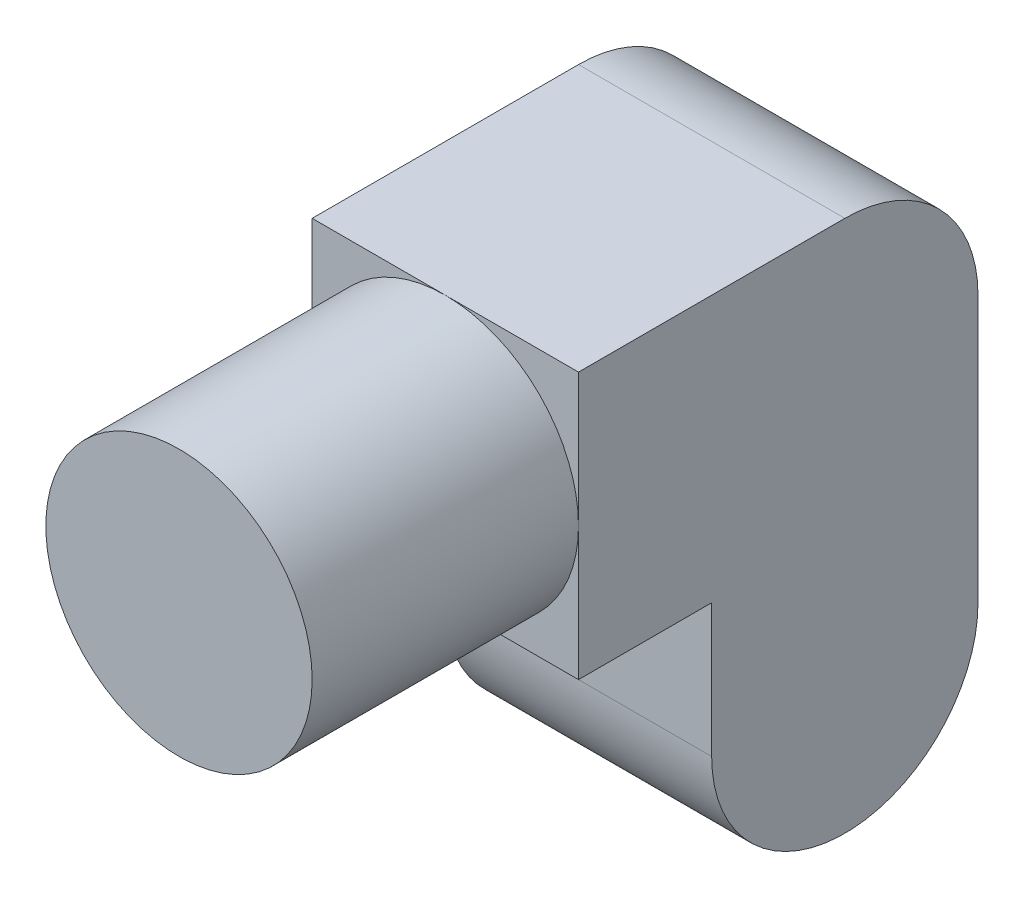
ISO-10303-21;
HEADER;
FILE_DESCRIPTION(('STEP AP214'),'2;1');
FILE_NAME('part.step','',(''),(''),'','','');
FILE_SCHEMA(('AUTOMOTIVE_DESIGN { 1 0 10303 214 1 1 1 1 }'));
ENDSEC;
DATA;
#1=APPLICATION_CONTEXT('core data for automotive mechanical design processes');
#2=APPLICATION_PROTOCOL_DEFINITION('international standard','automotive_design',2000,#1);
#3=PRODUCT_CONTEXT('',#1,'mechanical');
#4=PRODUCT('Part','Part','',(#3));
#5=PRODUCT_RELATED_PRODUCT_CATEGORY('part','',(#4));
#6=PRODUCT_DEFINITION_FORMATION('','',#4);
#7=PRODUCT_DEFINITION_CONTEXT('part definition',#1,'design');
#8=PRODUCT_DEFINITION('design','',#6,#7);
#9=PRODUCT_DEFINITION_SHAPE('','',#8);
#10=(LENGTH_UNIT() NAMED_UNIT(*) SI_UNIT(.MILLI.,.METRE.));
#11=(NAMED_UNIT(*) PLANE_ANGLE_UNIT() SI_UNIT($,.RADIAN.));
#12=(NAMED_UNIT(*) SI_UNIT($,.STERADIAN.) SOLID_ANGLE_UNIT());
#13=UNCERTAINTY_MEASURE_WITH_UNIT(LENGTH_MEASURE(1.E-05),#10,'distance_accuracy_value','');
#14=(GEOMETRIC_REPRESENTATION_CONTEXT(3) GLOBAL_UNCERTAINTY_ASSIGNED_CONTEXT((#13)) GLOBAL_UNIT_ASSIGNED_CONTEXT((#10,
#11,#12)) REPRESENTATION_CONTEXT('',''));
#15=CARTESIAN_POINT('',(0.,0.,0.));
#16=DIRECTION('',(0.,0.,1.));
#17=DIRECTION('',(1.,0.,0.));
#18=AXIS2_PLACEMENT_3D('',#15,#16,#17);
#19=CARTESIAN_POINT('',(80.,-40.,80.));
#20=DIRECTION('',(0.,1.,0.));
#21=DIRECTION('',(0.,0.,1.));
#22=AXIS2_PLACEMENT_3D('',#19,#20,#21);
#23=PLANE('',#22);
#24=DIRECTION('',(1.,0.,0.));
#25=VECTOR('',#24,1.);
#26=CARTESIAN_POINT('',(0.,-40.,40.));
#27=LINE('',#26,#25);
#28=CARTESIAN_POINT('',(40.,-40.,40.));
#29=VERTEX_POINT('',#28);
#30=CARTESIAN_POINT('',(80.,-40.,40.));
#31=VERTEX_POINT('',#30);
#32=EDGE_CURVE('E236',#29,#31,#27,.T.);
#33=ORIENTED_EDGE('',*,*,#32,.F.);
#34=DIRECTION('',(1.,0.,0.));
#35=VECTOR('',#34,1.);
#36=CARTESIAN_POINT('',(0.,-40.,40.));
#37=LINE('',#36,#35);
#38=CARTESIAN_POINT('',(0.,-40.,40.));
#39=VERTEX_POINT('',#38);
#40=EDGE_CURVE('E243',#39,#29,#37,.T.);
#41=ORIENTED_EDGE('',*,*,#40,.F.);
#42=DIRECTION('',(0.,0.,-1.));
#43=VECTOR('',#42,1.);
#44=CARTESIAN_POINT('',(0.,-40.,80.));
#45=LINE('',#44,#43);
#46=CARTESIAN_POINT('',(0.,-40.,0.));
#47=VERTEX_POINT('',#46);
#48=EDGE_CURVE('E75',#39,#47,#45,.T.);
#49=ORIENTED_EDGE('',*,*,#48,.T.);
#50=DIRECTION('',(-1.,0.,0.));
#51=VECTOR('',#50,1.);
#52=CARTESIAN_POINT('',(80.,-40.,0.));
#53=LINE('',#52,#51);
#54=CARTESIAN_POINT('',(80.,-40.,0.));
#55=VERTEX_POINT('',#54);
#56=EDGE_CURVE('E113',#55,#47,#53,.T.);
#57=ORIENTED_EDGE('',*,*,#56,.F.);
#58=DIRECTION('',(0.,0.,-1.));
#59=VECTOR('',#58,1.);
#60=CARTESIAN_POINT('',(80.,-40.,80.));
#61=LINE('',#60,#59);
#62=EDGE_CURVE('E120',#31,#55,#61,.T.);
#63=ORIENTED_EDGE('',*,*,#62,.F.);
#64=EDGE_LOOP('',(#33,#41,#49,#57,#63));
#65=FACE_BOUND('',#64,.T.);
#66=ADVANCED_FACE('F37',(#65),#23,.F.);
#67=CARTESIAN_POINT('',(80.,-80.,-40.));
#68=DIRECTION('',(1.,0.,0.));
#69=DIRECTION('',(0.,0.,-1.));
#70=AXIS2_PLACEMENT_3D('',#67,#68,#69);
#71=PLANE('',#70);
#72=DIRECTION('',(0.,1.,0.));
#73=VECTOR('',#72,1.);
#74=CARTESIAN_POINT('',(80.,0.,40.));
#75=LINE('',#74,#73);
#76=CARTESIAN_POINT('',(80.,0.,40.));
#77=VERTEX_POINT('',#76);
#78=CARTESIAN_POINT('',(80.,40.,40.));
#79=VERTEX_POINT('',#78);
#80=EDGE_CURVE('E170',#77,#79,#75,.T.);
#81=ORIENTED_EDGE('',*,*,#80,.F.);
#82=DIRECTION('',(0.,-1.,0.));
#83=VECTOR('',#82,1.);
#84=CARTESIAN_POINT('',(80.,0.,40.));
#85=LINE('',#84,#83);
#86=EDGE_CURVE('E237',#77,#31,#85,.T.);
#87=ORIENTED_EDGE('',*,*,#86,.T.);
#88=ORIENTED_EDGE('',*,*,#62,.T.);
#89=DIRECTION('',(0.,-1.,0.));
#90=VECTOR('',#89,1.);
#91=CARTESIAN_POINT('',(80.,-40.,0.));
#92=LINE('',#91,#90);
#93=CARTESIAN_POINT('',(80.,-80.,0.));
#94=VERTEX_POINT('',#93);
#95=EDGE_CURVE('E54',#55,#94,#92,.T.);
#96=ORIENTED_EDGE('',*,*,#95,.T.);
#97=CARTESIAN_POINT('',(80.,-80.,-40.));
#98=DIRECTION('',(1.,0.,0.));
#99=DIRECTION('',(0.,0.,-1.));
#100=AXIS2_PLACEMENT_3D('',#97,#98,#99);
#101=CIRCLE('',#100,40.);
#102=CARTESIAN_POINT('',(80.,-80.,-80.));
#103=VERTEX_POINT('',#102);
#104=EDGE_CURVE('E138',#94,#103,#101,.T.);
#105=ORIENTED_EDGE('',*,*,#104,.T.);
#106=DIRECTION('',(0.,1.,0.));
#107=VECTOR('',#106,1.);
#108=CARTESIAN_POINT('',(80.,-40.,-80.));
#109=LINE('',#108,#107);
#110=CARTESIAN_POINT('',(80.,0.,-80.));
#111=VERTEX_POINT('',#110);
#112=EDGE_CURVE('E89',#103,#111,#109,.T.);
#113=ORIENTED_EDGE('',*,*,#112,.T.);
#114=CARTESIAN_POINT('',(80.,0.,-40.));
#115=DIRECTION('',(1.,0.,0.));
#116=DIRECTION('',(0.,0.,-1.));
#117=AXIS2_PLACEMENT_3D('',#114,#115,#116);
#118=CIRCLE('',#117,40.);
#119=CARTESIAN_POINT('',(80.,40.,-40.));
#120=VERTEX_POINT('',#119);
#121=EDGE_CURVE('E96',#111,#120,#118,.T.);
#122=ORIENTED_EDGE('',*,*,#121,.T.);
#123=DIRECTION('',(0.,0.,1.));
#124=VECTOR('',#123,1.);
#125=CARTESIAN_POINT('',(80.,40.,80.));
#126=LINE('',#125,#124);
#127=EDGE_CURVE('E101',#120,#79,#126,.T.);
#128=ORIENTED_EDGE('',*,*,#127,.T.);
#129=EDGE_LOOP('',(#81,#87,#88,#96,#105,#113,#122,#128));
#130=FACE_BOUND('',#129,.T.);
#131=ADVANCED_FACE('F99',(#130),#71,.T.);
#132=CARTESIAN_POINT('',(80.,40.,80.));
#133=DIRECTION('',(0.,-1.,0.));
#134=DIRECTION('',(0.,0.,-1.));
#135=AXIS2_PLACEMENT_3D('',#132,#133,#134);
#136=PLANE('',#135);
#137=DIRECTION('',(1.,0.,0.));
#138=VECTOR('',#137,1.);
#139=CARTESIAN_POINT('',(0.,40.,40.));
#140=LINE('',#139,#138);
#141=CARTESIAN_POINT('',(0.,40.,40.));
#142=VERTEX_POINT('',#141);
#143=CARTESIAN_POINT('',(40.,40.,40.));
#144=VERTEX_POINT('',#143);
#145=EDGE_CURVE('E150',#142,#144,#140,.T.);
#146=ORIENTED_EDGE('',*,*,#145,.T.);
#147=DIRECTION('',(-1.,0.,0.));
#148=VECTOR('',#147,1.);
#149=CARTESIAN_POINT('',(0.,40.,40.));
#150=LINE('',#149,#148);
#151=EDGE_CURVE('E119',#79,#144,#150,.T.);
#152=ORIENTED_EDGE('',*,*,#151,.F.);
#153=ORIENTED_EDGE('',*,*,#127,.F.);
#154=DIRECTION('',(-1.,0.,0.));
#155=VECTOR('',#154,1.);
#156=CARTESIAN_POINT('',(80.,40.,-40.));
#157=LINE('',#156,#155);
#158=CARTESIAN_POINT('',(0.,40.,-40.));
#159=VERTEX_POINT('',#158);
#160=EDGE_CURVE('E106',#120,#159,#157,.T.);
#161=ORIENTED_EDGE('',*,*,#160,.T.);
#162=DIRECTION('',(0.,0.,1.));
#163=VECTOR('',#162,1.);
#164=CARTESIAN_POINT('',(0.,40.,80.));
#165=LINE('',#164,#163);
#166=EDGE_CURVE('E134',#159,#142,#165,.T.);
#167=ORIENTED_EDGE('',*,*,#166,.T.);
#168=EDGE_LOOP('',(#146,#152,#153,#161,#167));
#169=FACE_BOUND('',#168,.T.);
#170=ADVANCED_FACE('F117',(#169),#136,.F.);
#171=CARTESIAN_POINT('',(0.,-80.,-40.));
#172=DIRECTION('',(1.,0.,0.));
#173=DIRECTION('',(0.,0.,-1.));
#174=AXIS2_PLACEMENT_3D('',#171,#172,#173);
#175=PLANE('',#174);
#176=DIRECTION('',(0.,-1.,0.));
#177=VECTOR('',#176,1.);
#178=CARTESIAN_POINT('',(0.,0.,40.));
#179=LINE('',#178,#177);
#180=CARTESIAN_POINT('',(0.,0.,40.));
#181=VERTEX_POINT('',#180);
#182=EDGE_CURVE('E147',#142,#181,#179,.T.);
#183=ORIENTED_EDGE('',*,*,#182,.F.);
#184=ORIENTED_EDGE('',*,*,#166,.F.);
#185=CARTESIAN_POINT('',(0.,0.,-40.));
#186=DIRECTION('',(1.,0.,0.));
#187=DIRECTION('',(0.,0.,-1.));
#188=AXIS2_PLACEMENT_3D('',#185,#186,#187);
#189=CIRCLE('',#188,40.);
#190=CARTESIAN_POINT('',(0.,0.,-80.));
#191=VERTEX_POINT('',#190);
#192=EDGE_CURVE('E109',#191,#159,#189,.T.);
#193=ORIENTED_EDGE('',*,*,#192,.F.);
#194=DIRECTION('',(0.,1.,0.));
#195=VECTOR('',#194,1.);
#196=CARTESIAN_POINT('',(0.,-40.,-80.));
#197=LINE('',#196,#195);
#198=CARTESIAN_POINT('',(0.,-80.,-80.));
#199=VERTEX_POINT('',#198);
#200=EDGE_CURVE('E130',#199,#191,#197,.T.);
#201=ORIENTED_EDGE('',*,*,#200,.F.);
#202=CARTESIAN_POINT('',(0.,-80.,-40.));
#203=DIRECTION('',(1.,0.,0.));
#204=DIRECTION('',(0.,0.,-1.));
#205=AXIS2_PLACEMENT_3D('',#202,#203,#204);
#206=CIRCLE('',#205,40.);
#207=CARTESIAN_POINT('',(0.,-80.,0.));
#208=VERTEX_POINT('',#207);
#209=EDGE_CURVE('E127',#208,#199,#206,.T.);
#210=ORIENTED_EDGE('',*,*,#209,.F.);
#211=DIRECTION('',(0.,-1.,0.));
#212=VECTOR('',#211,1.);
#213=CARTESIAN_POINT('',(0.,-40.,0.));
#214=LINE('',#213,#212);
#215=EDGE_CURVE('E81',#47,#208,#214,.T.);
#216=ORIENTED_EDGE('',*,*,#215,.F.);
#217=ORIENTED_EDGE('',*,*,#48,.F.);
#218=DIRECTION('',(0.,-1.,0.));
#219=VECTOR('',#218,1.);
#220=CARTESIAN_POINT('',(0.,0.,40.));
#221=LINE('',#220,#219);
#222=EDGE_CURVE('E166',#181,#39,#221,.T.);
#223=ORIENTED_EDGE('',*,*,#222,.F.);
#224=EDGE_LOOP('',(#183,#184,#193,#201,#210,#216,#217,#223));
#225=FACE_BOUND('',#224,.T.);
#226=ADVANCED_FACE('F142',(#225),#175,.F.);
#227=CARTESIAN_POINT('',(80.,-80.,-40.));
#228=DIRECTION('',(-1.,0.,0.));
#229=DIRECTION('',(0.,0.,1.));
#230=AXIS2_PLACEMENT_3D('',#227,#228,#229);
#231=CYLINDRICAL_SURFACE('',#230,40.);
#232=ORIENTED_EDGE('',*,*,#209,.T.);
#233=DIRECTION('',(-1.,0.,0.));
#234=VECTOR('',#233,1.);
#235=CARTESIAN_POINT('',(80.,-80.,-80.));
#236=LINE('',#235,#234);
#237=EDGE_CURVE('E11',#103,#199,#236,.T.);
#238=ORIENTED_EDGE('',*,*,#237,.F.);
#239=ORIENTED_EDGE('',*,*,#104,.F.);
#240=DIRECTION('',(-1.,0.,0.));
#241=VECTOR('',#240,1.);
#242=CARTESIAN_POINT('',(80.,-80.,0.));
#243=LINE('',#242,#241);
#244=EDGE_CURVE('E126',#94,#208,#243,.T.);
#245=ORIENTED_EDGE('',*,*,#244,.T.);
#246=EDGE_LOOP('',(#232,#238,#239,#245));
#247=FACE_BOUND('',#246,.T.);
#248=ADVANCED_FACE('F39',(#247),#231,.T.);
#249=CARTESIAN_POINT('',(80.,-40.,-80.));
#250=DIRECTION('',(0.,0.,1.));
#251=DIRECTION('',(1.,0.,0.));
#252=AXIS2_PLACEMENT_3D('',#249,#250,#251);
#253=PLANE('',#252);
#254=ORIENTED_EDGE('',*,*,#200,.T.);
#255=DIRECTION('',(-1.,0.,0.));
#256=VECTOR('',#255,1.);
#257=CARTESIAN_POINT('',(80.,0.,-80.));
#258=LINE('',#257,#256);
#259=EDGE_CURVE('E46',#111,#191,#258,.T.);
#260=ORIENTED_EDGE('',*,*,#259,.F.);
#261=ORIENTED_EDGE('',*,*,#112,.F.);
#262=ORIENTED_EDGE('',*,*,#237,.T.);
#263=EDGE_LOOP('',(#254,#260,#261,#262));
#264=FACE_BOUND('',#263,.T.);
#265=ADVANCED_FACE('F183',(#264),#253,.F.);
#266=CARTESIAN_POINT('',(80.,0.,-40.));
#267=DIRECTION('',(-1.,0.,0.));
#268=DIRECTION('',(0.,0.,1.));
#269=AXIS2_PLACEMENT_3D('',#266,#267,#268);
#270=CYLINDRICAL_SURFACE('',#269,40.);
#271=ORIENTED_EDGE('',*,*,#192,.T.);
#272=ORIENTED_EDGE('',*,*,#160,.F.);
#273=ORIENTED_EDGE('',*,*,#121,.F.);
#274=ORIENTED_EDGE('',*,*,#259,.T.);
#275=EDGE_LOOP('',(#271,#272,#273,#274));
#276=FACE_BOUND('',#275,.T.);
#277=ADVANCED_FACE('F107',(#276),#270,.T.);
#278=CARTESIAN_POINT('',(80.,-40.,0.));
#279=DIRECTION('',(0.,0.,-1.));
#280=DIRECTION('',(0.,1.,0.));
#281=AXIS2_PLACEMENT_3D('',#278,#279,#280);
#282=PLANE('',#281);
#283=ORIENTED_EDGE('',*,*,#215,.T.);
#284=ORIENTED_EDGE('',*,*,#244,.F.);
#285=ORIENTED_EDGE('',*,*,#95,.F.);
#286=ORIENTED_EDGE('',*,*,#56,.T.);
#287=EDGE_LOOP('',(#283,#284,#285,#286));
#288=FACE_BOUND('',#287,.T.);
#289=ADVANCED_FACE('F189',(#288),#282,.F.);
#290=CARTESIAN_POINT('',(40.,0.,120.));
#291=DIRECTION('',(0.,0.,-1.));
#292=DIRECTION('',(-1.,0.,0.));
#293=AXIS2_PLACEMENT_3D('',#290,#291,#292);
#294=CYLINDRICAL_SURFACE('',#293,40.);
#295=CARTESIAN_POINT('',(40.,0.,120.));
#296=DIRECTION('',(0.,0.,1.));
#297=DIRECTION('',(1.,0.,0.));
#298=AXIS2_PLACEMENT_3D('',#295,#296,#297);
#299=CIRCLE('',#298,40.);
#300=CARTESIAN_POINT('',(80.,0.,120.));
#301=VERTEX_POINT('',#300);
#302=EDGE_CURVE('E131',#301,#301,#299,.T.);
#303=ORIENTED_EDGE('',*,*,#302,.F.);
#304=EDGE_LOOP('',(#303));
#305=FACE_BOUND('',#304,.T.);
#306=CARTESIAN_POINT('',(40.,0.,40.));
#307=DIRECTION('',(0.,0.,1.));
#308=DIRECTION('',(1.,0.,0.));
#309=AXIS2_PLACEMENT_3D('',#306,#307,#308);
#310=CIRCLE('',#309,40.);
#311=EDGE_CURVE('E245',#181,#29,#310,.T.);
#312=ORIENTED_EDGE('',*,*,#311,.T.);
#313=CARTESIAN_POINT('',(40.,0.,40.));
#314=DIRECTION('',(0.,0.,1.));
#315=DIRECTION('',(1.,0.,0.));
#316=AXIS2_PLACEMENT_3D('',#313,#314,#315);
#317=CIRCLE('',#316,40.);
#318=EDGE_CURVE('E234',#29,#77,#317,.T.);
#319=ORIENTED_EDGE('',*,*,#318,.T.);
#320=CARTESIAN_POINT('',(40.,0.,40.));
#321=DIRECTION('',(0.,0.,1.));
#322=DIRECTION('',(1.,0.,0.));
#323=AXIS2_PLACEMENT_3D('',#320,#321,#322);
#324=CIRCLE('',#323,40.);
#325=EDGE_CURVE('E172',#144,#77,#324,.F.);
#326=ORIENTED_EDGE('',*,*,#325,.F.);
#327=CARTESIAN_POINT('',(40.,0.,40.));
#328=DIRECTION('',(0.,0.,1.));
#329=DIRECTION('',(1.,0.,0.));
#330=AXIS2_PLACEMENT_3D('',#327,#328,#329);
#331=CIRCLE('',#330,40.);
#332=EDGE_CURVE('E246',#144,#181,#331,.T.);
#333=ORIENTED_EDGE('',*,*,#332,.T.);
#334=EDGE_LOOP('',(#312,#319,#326,#333));
#335=FACE_BOUND('',#334,.T.);
#336=ADVANCED_FACE('F208',(#305,#335),#294,.T.);
#337=CARTESIAN_POINT('',(40.,0.,120.));
#338=DIRECTION('',(0.,0.,1.));
#339=DIRECTION('',(1.,0.,0.));
#340=AXIS2_PLACEMENT_3D('',#337,#338,#339);
#341=PLANE('',#340);
#342=ORIENTED_EDGE('',*,*,#302,.T.);
#343=EDGE_LOOP('',(#342));
#344=FACE_BOUND('',#343,.T.);
#345=ADVANCED_FACE('F211',(#344),#341,.T.);
#346=CARTESIAN_POINT('',(0.,0.,40.));
#347=DIRECTION('',(0.,0.,1.));
#348=DIRECTION('',(1.,0.,0.));
#349=AXIS2_PLACEMENT_3D('',#346,#347,#348);
#350=PLANE('',#349);
#351=ORIENTED_EDGE('',*,*,#151,.T.);
#352=ORIENTED_EDGE('',*,*,#325,.T.);
#353=ORIENTED_EDGE('',*,*,#80,.T.);
#354=EDGE_LOOP('',(#351,#352,#353));
#355=FACE_BOUND('',#354,.T.);
#356=ADVANCED_FACE('F171',(#355),#350,.T.);
#357=CARTESIAN_POINT('',(0.,0.,40.));
#358=DIRECTION('',(0.,0.,1.));
#359=DIRECTION('',(1.,0.,0.));
#360=AXIS2_PLACEMENT_3D('',#357,#358,#359);
#361=PLANE('',#360);
#362=ORIENTED_EDGE('',*,*,#311,.F.);
#363=ORIENTED_EDGE('',*,*,#222,.T.);
#364=ORIENTED_EDGE('',*,*,#40,.T.);
#365=EDGE_LOOP('',(#362,#363,#364));
#366=FACE_BOUND('',#365,.T.);
#367=ADVANCED_FACE('F218',(#366),#361,.T.);
#368=CARTESIAN_POINT('',(0.,0.,40.));
#369=DIRECTION('',(0.,0.,1.));
#370=DIRECTION('',(1.,0.,0.));
#371=AXIS2_PLACEMENT_3D('',#368,#369,#370);
#372=PLANE('',#371);
#373=ORIENTED_EDGE('',*,*,#332,.F.);
#374=ORIENTED_EDGE('',*,*,#145,.F.);
#375=ORIENTED_EDGE('',*,*,#182,.T.);
#376=EDGE_LOOP('',(#373,#374,#375));
#377=FACE_BOUND('',#376,.T.);
#378=ADVANCED_FACE('F221',(#377),#372,.T.);
#379=CARTESIAN_POINT('',(0.,0.,40.));
#380=DIRECTION('',(0.,0.,1.));
#381=DIRECTION('',(1.,0.,0.));
#382=AXIS2_PLACEMENT_3D('',#379,#380,#381);
#383=PLANE('',#382);
#384=ORIENTED_EDGE('',*,*,#318,.F.);
#385=ORIENTED_EDGE('',*,*,#32,.T.);
#386=ORIENTED_EDGE('',*,*,#86,.F.);
#387=EDGE_LOOP('',(#384,#385,#386));
#388=FACE_BOUND('',#387,.T.);
#389=ADVANCED_FACE('F224',(#388),#383,.T.);
#390=CLOSED_SHELL('',(#66,#131,#170,#226,#248,#265,#277,#289,#336,#345,#356,#367,#378,#389));
#391=MANIFOLD_SOLID_BREP('B2',#390);
#392=ADVANCED_BREP_SHAPE_REPRESENTATION('',(#18,#391),#14);
#393=SHAPE_DEFINITION_REPRESENTATION(#9,#392);
ENDSEC;
END-ISO-10303-21;
